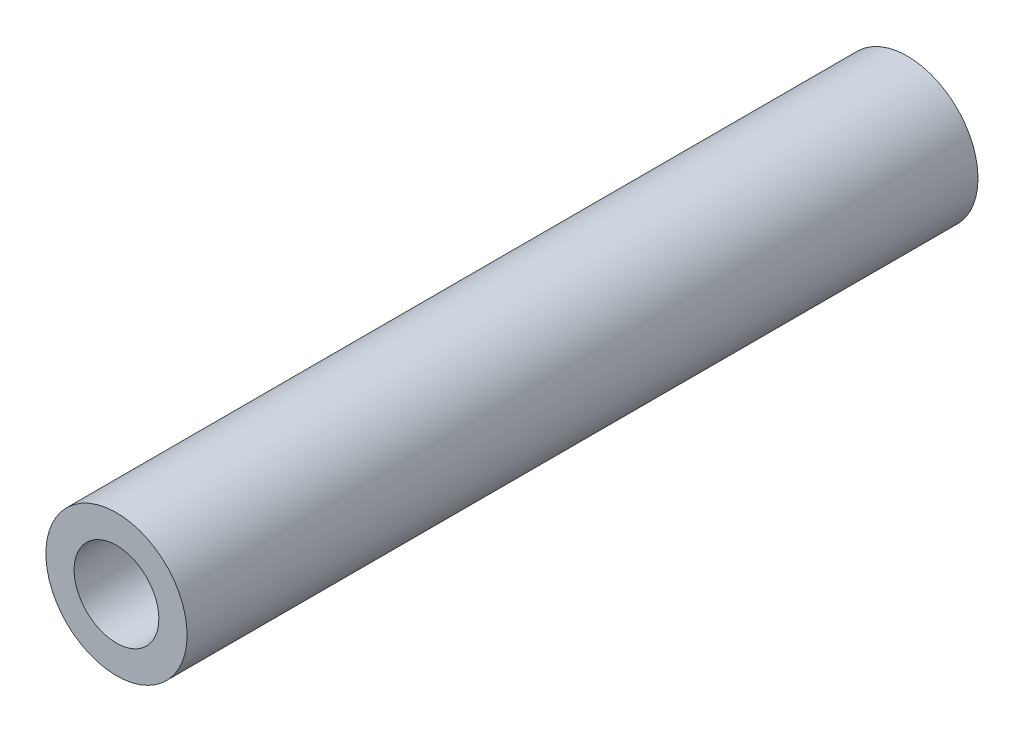
ISO-10303-21;
HEADER;
FILE_DESCRIPTION(('STEP AP214'),'2;1');
FILE_NAME('part.step','',(''),(''),'','','');
FILE_SCHEMA(('AUTOMOTIVE_DESIGN { 1 0 10303 214 1 1 1 1 }'));
ENDSEC;
DATA;
#1=APPLICATION_CONTEXT('core data for automotive mechanical design processes');
#2=APPLICATION_PROTOCOL_DEFINITION('international standard','automotive_design',2000,#1);
#3=PRODUCT_CONTEXT('',#1,'mechanical');
#4=PRODUCT('Part','Part','',(#3));
#5=PRODUCT_RELATED_PRODUCT_CATEGORY('part','',(#4));
#6=PRODUCT_DEFINITION_FORMATION('','',#4);
#7=PRODUCT_DEFINITION_CONTEXT('part definition',#1,'design');
#8=PRODUCT_DEFINITION('design','',#6,#7);
#9=PRODUCT_DEFINITION_SHAPE('','',#8);
#10=(LENGTH_UNIT() NAMED_UNIT(*) SI_UNIT(.MILLI.,.METRE.));
#11=(NAMED_UNIT(*) PLANE_ANGLE_UNIT() SI_UNIT($,.RADIAN.));
#12=(NAMED_UNIT(*) SI_UNIT($,.STERADIAN.) SOLID_ANGLE_UNIT());
#13=UNCERTAINTY_MEASURE_WITH_UNIT(LENGTH_MEASURE(1.E-05),#10,'distance_accuracy_value','');
#14=(GEOMETRIC_REPRESENTATION_CONTEXT(3) GLOBAL_UNCERTAINTY_ASSIGNED_CONTEXT((#13)) GLOBAL_UNIT_ASSIGNED_CONTEXT((#10,
#11,#12)) REPRESENTATION_CONTEXT('',''));
#15=CARTESIAN_POINT('',(0.,0.,0.));
#16=DIRECTION('',(0.,0.,1.));
#17=DIRECTION('',(1.,0.,0.));
#18=AXIS2_PLACEMENT_3D('',#15,#16,#17);
#19=CARTESIAN_POINT('',(0.,0.,28.));
#20=DIRECTION('',(0.,0.,1.));
#21=DIRECTION('',(1.,0.,0.));
#22=AXIS2_PLACEMENT_3D('',#19,#20,#21);
#23=PLANE('',#22);
#24=CARTESIAN_POINT('',(0.,0.,28.));
#25=DIRECTION('',(0.,0.,1.));
#26=DIRECTION('',(1.,0.,0.));
#27=AXIS2_PLACEMENT_3D('',#24,#25,#26);
#28=CIRCLE('',#27,2.5);
#29=CARTESIAN_POINT('',(2.5,0.,28.));
#30=VERTEX_POINT('',#29);
#31=EDGE_CURVE('E10',#30,#30,#28,.T.);
#32=ORIENTED_EDGE('',*,*,#31,.T.);
#33=EDGE_LOOP('',(#32));
#34=FACE_BOUND('',#33,.T.);
#35=CARTESIAN_POINT('',(0.,0.,28.));
#36=DIRECTION('',(0.,0.,1.));
#37=DIRECTION('',(1.,0.,0.));
#38=AXIS2_PLACEMENT_3D('',#35,#36,#37);
#39=CIRCLE('',#38,1.5);
#40=CARTESIAN_POINT('',(1.5,0.,28.));
#41=VERTEX_POINT('',#40);
#42=EDGE_CURVE('E42',#41,#41,#39,.T.);
#43=ORIENTED_EDGE('',*,*,#42,.F.);
#44=EDGE_LOOP('',(#43));
#45=FACE_BOUND('',#44,.T.);
#46=ADVANCED_FACE('F31',(#34,#45),#23,.T.);
#47=CARTESIAN_POINT('',(0.,0.,0.));
#48=DIRECTION('',(0.,0.,1.));
#49=DIRECTION('',(1.,0.,0.));
#50=AXIS2_PLACEMENT_3D('',#47,#48,#49);
#51=PLANE('',#50);
#52=CARTESIAN_POINT('',(0.,0.,0.));
#53=DIRECTION('',(0.,0.,1.));
#54=DIRECTION('',(1.,0.,0.));
#55=AXIS2_PLACEMENT_3D('',#52,#53,#54);
#56=CIRCLE('',#55,2.5);
#57=CARTESIAN_POINT('',(2.5,0.,0.));
#58=VERTEX_POINT('',#57);
#59=EDGE_CURVE('E35',#58,#58,#56,.T.);
#60=ORIENTED_EDGE('',*,*,#59,.F.);
#61=EDGE_LOOP('',(#60));
#62=FACE_BOUND('',#61,.T.);
#63=CARTESIAN_POINT('',(0.,0.,0.));
#64=DIRECTION('',(0.,0.,1.));
#65=DIRECTION('',(1.,0.,0.));
#66=AXIS2_PLACEMENT_3D('',#63,#64,#65);
#67=CIRCLE('',#66,1.5);
#68=CARTESIAN_POINT('',(1.5,0.,0.));
#69=VERTEX_POINT('',#68);
#70=EDGE_CURVE('E44',#69,#69,#67,.T.);
#71=ORIENTED_EDGE('',*,*,#70,.T.);
#72=EDGE_LOOP('',(#71));
#73=FACE_BOUND('',#72,.T.);
#74=ADVANCED_FACE('F54',(#62,#73),#51,.F.);
#75=CARTESIAN_POINT('',(0.,0.,28.));
#76=DIRECTION('',(0.,0.,-1.));
#77=DIRECTION('',(-1.,0.,0.));
#78=AXIS2_PLACEMENT_3D('',#75,#76,#77);
#79=CYLINDRICAL_SURFACE('',#78,2.5);
#80=ORIENTED_EDGE('',*,*,#31,.F.);
#81=EDGE_LOOP('',(#80));
#82=FACE_BOUND('',#81,.T.);
#83=ORIENTED_EDGE('',*,*,#59,.T.);
#84=EDGE_LOOP('',(#83));
#85=FACE_BOUND('',#84,.T.);
#86=ADVANCED_FACE('F33',(#82,#85),#79,.T.);
#87=CARTESIAN_POINT('',(0.,0.,28.));
#88=DIRECTION('',(0.,0.,-1.));
#89=DIRECTION('',(-1.,0.,0.));
#90=AXIS2_PLACEMENT_3D('',#87,#88,#89);
#91=CYLINDRICAL_SURFACE('',#90,1.5);
#92=ORIENTED_EDGE('',*,*,#42,.T.);
#93=EDGE_LOOP('',(#92));
#94=FACE_BOUND('',#93,.T.);
#95=ORIENTED_EDGE('',*,*,#70,.F.);
#96=EDGE_LOOP('',(#95));
#97=FACE_BOUND('',#96,.T.);
#98=ADVANCED_FACE('F50',(#94,#97),#91,.F.);
#99=CLOSED_SHELL('',(#46,#74,#86,#98));
#100=MANIFOLD_SOLID_BREP('B2',#99);
#101=ADVANCED_BREP_SHAPE_REPRESENTATION('',(#18,#100),#14);
#102=SHAPE_DEFINITION_REPRESENTATION(#9,#101);
ENDSEC;
END-ISO-10303-21;
